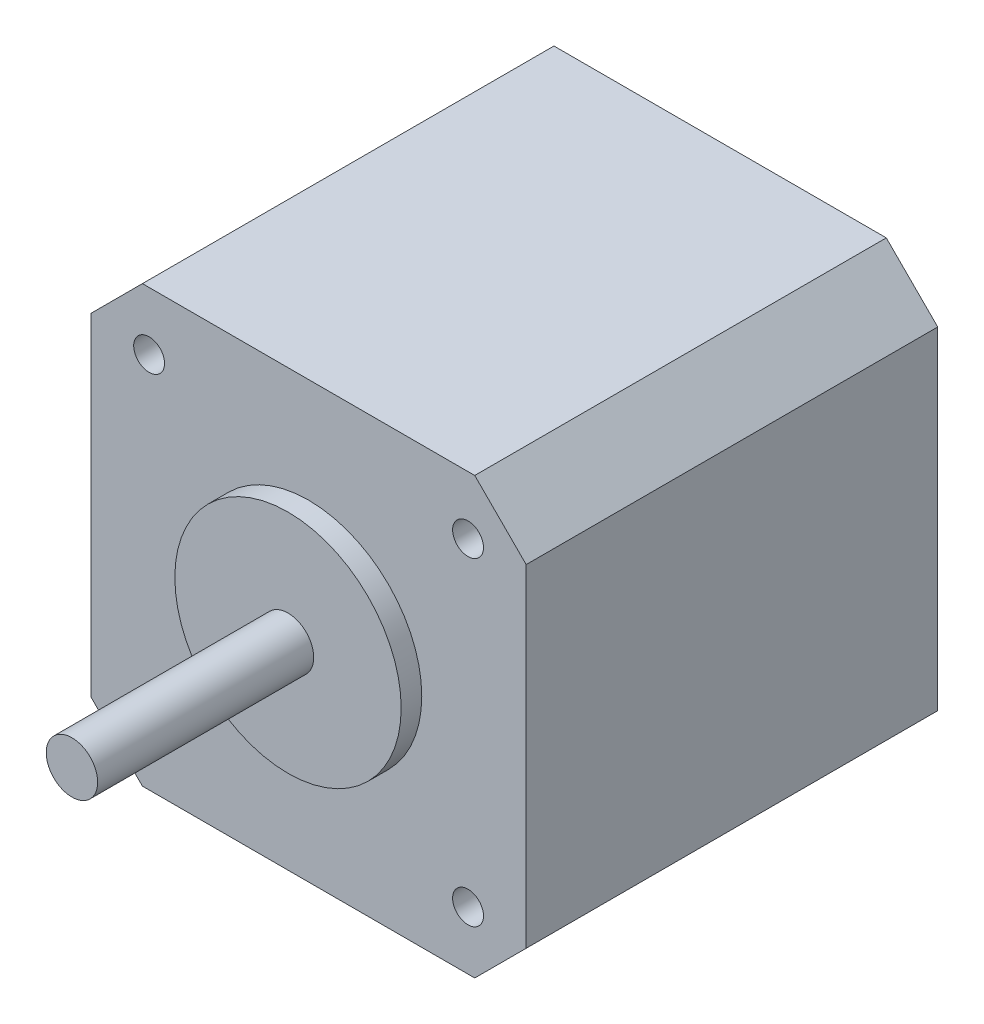
ISO-10303-21;
HEADER;
FILE_DESCRIPTION(('STEP AP214'),'2;1');
FILE_NAME('part.step','',(''),(''),'','','');
FILE_SCHEMA(('AUTOMOTIVE_DESIGN { 1 0 10303 214 1 1 1 1 }'));
ENDSEC;
DATA;
#1=APPLICATION_CONTEXT('core data for automotive mechanical design processes');
#2=APPLICATION_PROTOCOL_DEFINITION('international standard','automotive_design',2000,#1);
#3=PRODUCT_CONTEXT('',#1,'mechanical');
#4=PRODUCT('Part','Part','',(#3));
#5=PRODUCT_RELATED_PRODUCT_CATEGORY('part','',(#4));
#6=PRODUCT_DEFINITION_FORMATION('','',#4);
#7=PRODUCT_DEFINITION_CONTEXT('part definition',#1,'design');
#8=PRODUCT_DEFINITION('design','',#6,#7);
#9=PRODUCT_DEFINITION_SHAPE('','',#8);
#10=(LENGTH_UNIT() NAMED_UNIT(*) SI_UNIT(.MILLI.,.METRE.));
#11=(NAMED_UNIT(*) PLANE_ANGLE_UNIT() SI_UNIT($,.RADIAN.));
#12=(NAMED_UNIT(*) SI_UNIT($,.STERADIAN.) SOLID_ANGLE_UNIT());
#13=UNCERTAINTY_MEASURE_WITH_UNIT(LENGTH_MEASURE(1.E-05),#10,'distance_accuracy_value','');
#14=(GEOMETRIC_REPRESENTATION_CONTEXT(3) GLOBAL_UNCERTAINTY_ASSIGNED_CONTEXT((#13)) GLOBAL_UNIT_ASSIGNED_CONTEXT((#10,
#11,#12)) REPRESENTATION_CONTEXT('',''));
#15=CARTESIAN_POINT('',(0.,0.,0.));
#16=DIRECTION('',(0.,0.,1.));
#17=DIRECTION('',(1.,0.,0.));
#18=AXIS2_PLACEMENT_3D('',#15,#16,#17);
#19=CARTESIAN_POINT('',(0.,0.,20.));
#20=DIRECTION('',(0.,0.,-1.));
#21=DIRECTION('',(-1.,0.,0.));
#22=AXIS2_PLACEMENT_3D('',#19,#20,#21);
#23=PLANE('',#22);
#24=CARTESIAN_POINT('',(0.,0.,20.));
#25=DIRECTION('',(0.,0.,1.));
#26=DIRECTION('',(1.,0.,0.));
#27=AXIS2_PLACEMENT_3D('',#24,#25,#26);
#28=CIRCLE('',#27,11.);
#29=CARTESIAN_POINT('',(11.,0.,20.));
#30=VERTEX_POINT('',#29);
#31=EDGE_CURVE('E143',#30,#30,#28,.T.);
#32=ORIENTED_EDGE('',*,*,#31,.F.);
#33=EDGE_LOOP('',(#32));
#34=FACE_BOUND('',#33,.T.);
#35=DIRECTION('',(0.,-1.,0.));
#36=VECTOR('',#35,1.);
#37=CARTESIAN_POINT('',(-21.15,21.15,20.));
#38=LINE('',#37,#36);
#39=CARTESIAN_POINT('',(-21.15,16.15,20.));
#40=VERTEX_POINT('',#39);
#41=CARTESIAN_POINT('',(-21.15,-16.15,20.));
#42=VERTEX_POINT('',#41);
#43=EDGE_CURVE('E137',#40,#42,#38,.T.);
#44=ORIENTED_EDGE('',*,*,#43,.T.);
#45=DIRECTION('',(-0.707106781186547,0.707106781186548,0.));
#46=VECTOR('',#45,1.);
#47=CARTESIAN_POINT('',(-16.15,-21.15,20.));
#48=LINE('',#47,#46);
#49=CARTESIAN_POINT('',(-16.15,-21.15,20.));
#50=VERTEX_POINT('',#49);
#51=EDGE_CURVE('E157',#42,#50,#48,.F.);
#52=ORIENTED_EDGE('',*,*,#51,.T.);
#53=DIRECTION('',(1.,0.,0.));
#54=VECTOR('',#53,1.);
#55=CARTESIAN_POINT('',(21.15,-21.15,20.));
#56=LINE('',#55,#54);
#57=CARTESIAN_POINT('',(16.15,-21.15,20.));
#58=VERTEX_POINT('',#57);
#59=EDGE_CURVE('E119',#50,#58,#56,.T.);
#60=ORIENTED_EDGE('',*,*,#59,.T.);
#61=DIRECTION('',(-0.70710678118655,-0.707106781186546,0.));
#62=VECTOR('',#61,1.);
#63=CARTESIAN_POINT('',(21.15,-16.15,20.));
#64=LINE('',#63,#62);
#65=CARTESIAN_POINT('',(21.15,-16.15,20.));
#66=VERTEX_POINT('',#65);
#67=EDGE_CURVE('E155',#58,#66,#64,.F.);
#68=ORIENTED_EDGE('',*,*,#67,.T.);
#69=DIRECTION('',(0.,1.,0.));
#70=VECTOR('',#69,1.);
#71=CARTESIAN_POINT('',(21.15,21.15,20.));
#72=LINE('',#71,#70);
#73=CARTESIAN_POINT('',(21.15,16.15,20.));
#74=VERTEX_POINT('',#73);
#75=EDGE_CURVE('E178',#66,#74,#72,.T.);
#76=ORIENTED_EDGE('',*,*,#75,.T.);
#77=DIRECTION('',(0.707106781186546,-0.70710678118655,0.));
#78=VECTOR('',#77,1.);
#79=CARTESIAN_POINT('',(16.15,21.15,20.));
#80=LINE('',#79,#78);
#81=CARTESIAN_POINT('',(16.15,21.15,20.));
#82=VERTEX_POINT('',#81);
#83=EDGE_CURVE('E54',#74,#82,#80,.F.);
#84=ORIENTED_EDGE('',*,*,#83,.T.);
#85=DIRECTION('',(-1.,0.,0.));
#86=VECTOR('',#85,1.);
#87=CARTESIAN_POINT('',(21.15,21.15,20.));
#88=LINE('',#87,#86);
#89=CARTESIAN_POINT('',(-16.15,21.15,20.));
#90=VERTEX_POINT('',#89);
#91=EDGE_CURVE('E167',#82,#90,#88,.T.);
#92=ORIENTED_EDGE('',*,*,#91,.T.);
#93=DIRECTION('',(0.70710678118655,0.707106781186546,0.));
#94=VECTOR('',#93,1.);
#95=CARTESIAN_POINT('',(-21.15,16.15,20.));
#96=LINE('',#95,#94);
#97=EDGE_CURVE('E153',#90,#40,#96,.F.);
#98=ORIENTED_EDGE('',*,*,#97,.T.);
#99=EDGE_LOOP('',(#44,#52,#60,#68,#76,#84,#92,#98));
#100=FACE_BOUND('',#99,.T.);
#101=CARTESIAN_POINT('',(-15.5,15.5,20.));
#102=DIRECTION('',(0.,0.,1.));
#103=DIRECTION('',(1.,0.,0.));
#104=AXIS2_PLACEMENT_3D('',#101,#102,#103);
#105=CIRCLE('',#104,1.5);
#106=CARTESIAN_POINT('',(-14.,15.5,20.));
#107=VERTEX_POINT('',#106);
#108=EDGE_CURVE('E132',#107,#107,#105,.T.);
#109=ORIENTED_EDGE('',*,*,#108,.F.);
#110=EDGE_LOOP('',(#109));
#111=FACE_BOUND('',#110,.T.);
#112=CARTESIAN_POINT('',(-15.5,-15.5,20.));
#113=DIRECTION('',(0.,0.,1.));
#114=DIRECTION('',(1.,0.,0.));
#115=AXIS2_PLACEMENT_3D('',#112,#113,#114);
#116=CIRCLE('',#115,1.5);
#117=CARTESIAN_POINT('',(-14.,-15.5,20.));
#118=VERTEX_POINT('',#117);
#119=EDGE_CURVE('E204',#118,#118,#116,.T.);
#120=ORIENTED_EDGE('',*,*,#119,.F.);
#121=EDGE_LOOP('',(#120));
#122=FACE_BOUND('',#121,.T.);
#123=CARTESIAN_POINT('',(15.5,-15.5,20.));
#124=DIRECTION('',(0.,0.,1.));
#125=DIRECTION('',(-1.,0.,0.));
#126=AXIS2_PLACEMENT_3D('',#123,#124,#125);
#127=CIRCLE('',#126,1.5);
#128=CARTESIAN_POINT('',(14.,-15.5,20.));
#129=VERTEX_POINT('',#128);
#130=EDGE_CURVE('E198',#129,#129,#127,.T.);
#131=ORIENTED_EDGE('',*,*,#130,.F.);
#132=EDGE_LOOP('',(#131));
#133=FACE_BOUND('',#132,.T.);
#134=CARTESIAN_POINT('',(15.5,15.5,20.));
#135=DIRECTION('',(0.,0.,1.));
#136=DIRECTION('',(-1.,0.,0.));
#137=AXIS2_PLACEMENT_3D('',#134,#135,#136);
#138=CIRCLE('',#137,1.5);
#139=CARTESIAN_POINT('',(14.,15.5,20.));
#140=VERTEX_POINT('',#139);
#141=EDGE_CURVE('E191',#140,#140,#138,.T.);
#142=ORIENTED_EDGE('',*,*,#141,.F.);
#143=EDGE_LOOP('',(#142));
#144=FACE_BOUND('',#143,.T.);
#145=ADVANCED_FACE('F34',(#34,#100,#111,#122,#133,#144),#23,.F.);
#146=CARTESIAN_POINT('',(0.,0.,-20.));
#147=DIRECTION('',(0.,0.,-1.));
#148=DIRECTION('',(-1.,0.,0.));
#149=AXIS2_PLACEMENT_3D('',#146,#147,#148);
#150=PLANE('',#149);
#151=CARTESIAN_POINT('',(15.5,-15.5,-20.));
#152=DIRECTION('',(0.,0.,1.));
#153=DIRECTION('',(-1.,0.,0.));
#154=AXIS2_PLACEMENT_3D('',#151,#152,#153);
#155=CIRCLE('',#154,1.5);
#156=CARTESIAN_POINT('',(14.,-15.5,-20.));
#157=VERTEX_POINT('',#156);
#158=EDGE_CURVE('E194',#157,#157,#155,.T.);
#159=ORIENTED_EDGE('',*,*,#158,.T.);
#160=EDGE_LOOP('',(#159));
#161=FACE_BOUND('',#160,.T.);
#162=CARTESIAN_POINT('',(-15.5,15.5,-20.));
#163=DIRECTION('',(0.,0.,1.));
#164=DIRECTION('',(1.,0.,0.));
#165=AXIS2_PLACEMENT_3D('',#162,#163,#164);
#166=CIRCLE('',#165,1.5);
#167=CARTESIAN_POINT('',(-14.,15.5,-20.));
#168=VERTEX_POINT('',#167);
#169=EDGE_CURVE('E181',#168,#168,#166,.T.);
#170=ORIENTED_EDGE('',*,*,#169,.T.);
#171=EDGE_LOOP('',(#170));
#172=FACE_BOUND('',#171,.T.);
#173=DIRECTION('',(1.,0.,0.));
#174=VECTOR('',#173,1.);
#175=CARTESIAN_POINT('',(21.15,-21.15,-20.));
#176=LINE('',#175,#174);
#177=CARTESIAN_POINT('',(-16.15,-21.15,-20.));
#178=VERTEX_POINT('',#177);
#179=CARTESIAN_POINT('',(16.15,-21.15,-20.));
#180=VERTEX_POINT('',#179);
#181=EDGE_CURVE('E116',#178,#180,#176,.T.);
#182=ORIENTED_EDGE('',*,*,#181,.F.);
#183=DIRECTION('',(0.707106781186547,-0.707106781186548,0.));
#184=VECTOR('',#183,1.);
#185=CARTESIAN_POINT('',(-18.65,-18.65,-20.));
#186=LINE('',#185,#184);
#187=CARTESIAN_POINT('',(-21.15,-16.15,-20.));
#188=VERTEX_POINT('',#187);
#189=EDGE_CURVE('E99',#178,#188,#186,.F.);
#190=ORIENTED_EDGE('',*,*,#189,.T.);
#191=DIRECTION('',(0.,-1.,0.));
#192=VECTOR('',#191,1.);
#193=CARTESIAN_POINT('',(-21.15,21.15,-20.));
#194=LINE('',#193,#192);
#195=CARTESIAN_POINT('',(-21.15,16.15,-20.));
#196=VERTEX_POINT('',#195);
#197=EDGE_CURVE('E127',#196,#188,#194,.T.);
#198=ORIENTED_EDGE('',*,*,#197,.F.);
#199=DIRECTION('',(-0.70710678118655,-0.707106781186546,0.));
#200=VECTOR('',#199,1.);
#201=CARTESIAN_POINT('',(-18.6499999999999,18.65,-20.));
#202=LINE('',#201,#200);
#203=CARTESIAN_POINT('',(-16.15,21.15,-20.));
#204=VERTEX_POINT('',#203);
#205=EDGE_CURVE('E146',#196,#204,#202,.F.);
#206=ORIENTED_EDGE('',*,*,#205,.T.);
#207=DIRECTION('',(-1.,0.,0.));
#208=VECTOR('',#207,1.);
#209=CARTESIAN_POINT('',(21.15,21.15,-20.));
#210=LINE('',#209,#208);
#211=CARTESIAN_POINT('',(16.15,21.15,-20.));
#212=VERTEX_POINT('',#211);
#213=EDGE_CURVE('E130',#212,#204,#210,.T.);
#214=ORIENTED_EDGE('',*,*,#213,.F.);
#215=DIRECTION('',(-0.707106781186546,0.70710678118655,0.));
#216=VECTOR('',#215,1.);
#217=CARTESIAN_POINT('',(18.65,18.6499999999999,-20.));
#218=LINE('',#217,#216);
#219=CARTESIAN_POINT('',(21.15,16.15,-20.));
#220=VERTEX_POINT('',#219);
#221=EDGE_CURVE('E120',#212,#220,#218,.F.);
#222=ORIENTED_EDGE('',*,*,#221,.T.);
#223=DIRECTION('',(0.,1.,0.));
#224=VECTOR('',#223,1.);
#225=CARTESIAN_POINT('',(21.15,21.15,-20.));
#226=LINE('',#225,#224);
#227=CARTESIAN_POINT('',(21.15,-16.15,-20.));
#228=VERTEX_POINT('',#227);
#229=EDGE_CURVE('E126',#228,#220,#226,.T.);
#230=ORIENTED_EDGE('',*,*,#229,.F.);
#231=DIRECTION('',(0.70710678118655,0.707106781186546,0.));
#232=VECTOR('',#231,1.);
#233=CARTESIAN_POINT('',(18.6499999999999,-18.65,-20.));
#234=LINE('',#233,#232);
#235=EDGE_CURVE('E110',#228,#180,#234,.F.);
#236=ORIENTED_EDGE('',*,*,#235,.T.);
#237=EDGE_LOOP('',(#182,#190,#198,#206,#214,#222,#230,#236));
#238=FACE_BOUND('',#237,.T.);
#239=CARTESIAN_POINT('',(-15.5,-15.5,-20.));
#240=DIRECTION('',(0.,0.,1.));
#241=DIRECTION('',(1.,0.,0.));
#242=AXIS2_PLACEMENT_3D('',#239,#240,#241);
#243=CIRCLE('',#242,1.5);
#244=CARTESIAN_POINT('',(-14.,-15.5,-20.));
#245=VERTEX_POINT('',#244);
#246=EDGE_CURVE('E201',#245,#245,#243,.T.);
#247=ORIENTED_EDGE('',*,*,#246,.T.);
#248=EDGE_LOOP('',(#247));
#249=FACE_BOUND('',#248,.T.);
#250=CARTESIAN_POINT('',(15.5,15.5,-20.));
#251=DIRECTION('',(0.,0.,1.));
#252=DIRECTION('',(-1.,0.,0.));
#253=AXIS2_PLACEMENT_3D('',#250,#251,#252);
#254=CIRCLE('',#253,1.5);
#255=CARTESIAN_POINT('',(14.,15.5,-20.));
#256=VERTEX_POINT('',#255);
#257=EDGE_CURVE('E195',#256,#256,#254,.T.);
#258=ORIENTED_EDGE('',*,*,#257,.T.);
#259=EDGE_LOOP('',(#258));
#260=FACE_BOUND('',#259,.T.);
#261=ADVANCED_FACE('F123',(#161,#172,#238,#249,#260),#150,.T.);
#262=CARTESIAN_POINT('',(-21.15,21.15,20.));
#263=DIRECTION('',(1.,0.,0.));
#264=DIRECTION('',(0.,0.,-1.));
#265=AXIS2_PLACEMENT_3D('',#262,#263,#264);
#266=PLANE('',#265);
#267=ORIENTED_EDGE('',*,*,#197,.T.);
#268=DIRECTION('',(0.,0.,1.));
#269=VECTOR('',#268,1.);
#270=CARTESIAN_POINT('',(-21.15,-16.15,20.));
#271=LINE('',#270,#269);
#272=EDGE_CURVE('E104',#188,#42,#271,.T.);
#273=ORIENTED_EDGE('',*,*,#272,.T.);
#274=ORIENTED_EDGE('',*,*,#43,.F.);
#275=DIRECTION('',(0.,0.,-1.));
#276=VECTOR('',#275,1.);
#277=CARTESIAN_POINT('',(-21.15,16.15,20.));
#278=LINE('',#277,#276);
#279=EDGE_CURVE('E109',#40,#196,#278,.T.);
#280=ORIENTED_EDGE('',*,*,#279,.T.);
#281=EDGE_LOOP('',(#267,#273,#274,#280));
#282=FACE_BOUND('',#281,.T.);
#283=ADVANCED_FACE('F175',(#282),#266,.F.);
#284=CARTESIAN_POINT('',(21.15,-21.15,20.));
#285=DIRECTION('',(0.,1.,0.));
#286=DIRECTION('',(-1.,0.,0.));
#287=AXIS2_PLACEMENT_3D('',#284,#285,#286);
#288=PLANE('',#287);
#289=ORIENTED_EDGE('',*,*,#59,.F.);
#290=DIRECTION('',(0.,0.,-1.));
#291=VECTOR('',#290,1.);
#292=CARTESIAN_POINT('',(-16.15,-21.15,20.));
#293=LINE('',#292,#291);
#294=EDGE_CURVE('E103',#50,#178,#293,.T.);
#295=ORIENTED_EDGE('',*,*,#294,.T.);
#296=ORIENTED_EDGE('',*,*,#181,.T.);
#297=DIRECTION('',(0.,0.,1.));
#298=VECTOR('',#297,1.);
#299=CARTESIAN_POINT('',(16.15,-21.15,20.));
#300=LINE('',#299,#298);
#301=EDGE_CURVE('E121',#180,#58,#300,.T.);
#302=ORIENTED_EDGE('',*,*,#301,.T.);
#303=EDGE_LOOP('',(#289,#295,#296,#302));
#304=FACE_BOUND('',#303,.T.);
#305=ADVANCED_FACE('F115',(#304),#288,.F.);
#306=CARTESIAN_POINT('',(21.15,21.15,20.));
#307=DIRECTION('',(-1.,0.,0.));
#308=DIRECTION('',(0.,-1.,0.));
#309=AXIS2_PLACEMENT_3D('',#306,#307,#308);
#310=PLANE('',#309);
#311=ORIENTED_EDGE('',*,*,#75,.F.);
#312=DIRECTION('',(0.,0.,-1.));
#313=VECTOR('',#312,1.);
#314=CARTESIAN_POINT('',(21.15,-16.15,20.));
#315=LINE('',#314,#313);
#316=EDGE_CURVE('E161',#66,#228,#315,.T.);
#317=ORIENTED_EDGE('',*,*,#316,.T.);
#318=ORIENTED_EDGE('',*,*,#229,.T.);
#319=DIRECTION('',(0.,0.,1.));
#320=VECTOR('',#319,1.);
#321=CARTESIAN_POINT('',(21.15,16.15,20.));
#322=LINE('',#321,#320);
#323=EDGE_CURVE('E159',#220,#74,#322,.T.);
#324=ORIENTED_EDGE('',*,*,#323,.T.);
#325=EDGE_LOOP('',(#311,#317,#318,#324));
#326=FACE_BOUND('',#325,.T.);
#327=ADVANCED_FACE('F226',(#326),#310,.F.);
#328=CARTESIAN_POINT('',(21.15,21.15,20.));
#329=DIRECTION('',(0.,-1.,0.));
#330=DIRECTION('',(1.,0.,0.));
#331=AXIS2_PLACEMENT_3D('',#328,#329,#330);
#332=PLANE('',#331);
#333=ORIENTED_EDGE('',*,*,#213,.T.);
#334=DIRECTION('',(0.,0.,1.));
#335=VECTOR('',#334,1.);
#336=CARTESIAN_POINT('',(-16.15,21.15,20.));
#337=LINE('',#336,#335);
#338=EDGE_CURVE('E11',#204,#90,#337,.T.);
#339=ORIENTED_EDGE('',*,*,#338,.T.);
#340=ORIENTED_EDGE('',*,*,#91,.F.);
#341=DIRECTION('',(0.,0.,-1.));
#342=VECTOR('',#341,1.);
#343=CARTESIAN_POINT('',(16.15,21.15,20.));
#344=LINE('',#343,#342);
#345=EDGE_CURVE('E42',#82,#212,#344,.T.);
#346=ORIENTED_EDGE('',*,*,#345,.T.);
#347=EDGE_LOOP('',(#333,#339,#340,#346));
#348=FACE_BOUND('',#347,.T.);
#349=ADVANCED_FACE('F166',(#348),#332,.F.);
#350=CARTESIAN_POINT('',(-15.5,15.5,20.));
#351=DIRECTION('',(0.,0.,-1.));
#352=DIRECTION('',(-1.,0.,0.));
#353=AXIS2_PLACEMENT_3D('',#350,#351,#352);
#354=CYLINDRICAL_SURFACE('',#353,1.5);
#355=ORIENTED_EDGE('',*,*,#108,.T.);
#356=EDGE_LOOP('',(#355));
#357=FACE_BOUND('',#356,.T.);
#358=ORIENTED_EDGE('',*,*,#169,.F.);
#359=EDGE_LOOP('',(#358));
#360=FACE_BOUND('',#359,.T.);
#361=ADVANCED_FACE('F215',(#357,#360),#354,.F.);
#362=CARTESIAN_POINT('',(-15.5,-15.5,20.));
#363=DIRECTION('',(0.,0.,-1.));
#364=DIRECTION('',(-1.,0.,0.));
#365=AXIS2_PLACEMENT_3D('',#362,#363,#364);
#366=CYLINDRICAL_SURFACE('',#365,1.5);
#367=ORIENTED_EDGE('',*,*,#119,.T.);
#368=EDGE_LOOP('',(#367));
#369=FACE_BOUND('',#368,.T.);
#370=ORIENTED_EDGE('',*,*,#246,.F.);
#371=EDGE_LOOP('',(#370));
#372=FACE_BOUND('',#371,.T.);
#373=ADVANCED_FACE('F217',(#369,#372),#366,.F.);
#374=CARTESIAN_POINT('',(15.5,-15.5,20.));
#375=DIRECTION('',(0.,0.,-1.));
#376=DIRECTION('',(-1.,0.,0.));
#377=AXIS2_PLACEMENT_3D('',#374,#375,#376);
#378=CYLINDRICAL_SURFACE('',#377,1.5);
#379=ORIENTED_EDGE('',*,*,#130,.T.);
#380=EDGE_LOOP('',(#379));
#381=FACE_BOUND('',#380,.T.);
#382=ORIENTED_EDGE('',*,*,#158,.F.);
#383=EDGE_LOOP('',(#382));
#384=FACE_BOUND('',#383,.T.);
#385=ADVANCED_FACE('F223',(#381,#384),#378,.F.);
#386=CARTESIAN_POINT('',(15.5,15.5,20.));
#387=DIRECTION('',(0.,0.,-1.));
#388=DIRECTION('',(-1.,0.,0.));
#389=AXIS2_PLACEMENT_3D('',#386,#387,#388);
#390=CYLINDRICAL_SURFACE('',#389,1.5);
#391=ORIENTED_EDGE('',*,*,#141,.T.);
#392=EDGE_LOOP('',(#391));
#393=FACE_BOUND('',#392,.T.);
#394=ORIENTED_EDGE('',*,*,#257,.F.);
#395=EDGE_LOOP('',(#394));
#396=FACE_BOUND('',#395,.T.);
#397=ADVANCED_FACE('F268',(#393,#396),#390,.F.);
#398=CARTESIAN_POINT('',(0.,0.,22.));
#399=DIRECTION('',(0.,0.,-1.));
#400=DIRECTION('',(-1.,0.,0.));
#401=AXIS2_PLACEMENT_3D('',#398,#399,#400);
#402=CYLINDRICAL_SURFACE('',#401,11.);
#403=CARTESIAN_POINT('',(0.,0.,22.));
#404=DIRECTION('',(0.,0.,1.));
#405=DIRECTION('',(1.,0.,0.));
#406=AXIS2_PLACEMENT_3D('',#403,#404,#405);
#407=CIRCLE('',#406,11.);
#408=CARTESIAN_POINT('',(11.,0.,22.));
#409=VERTEX_POINT('',#408);
#410=EDGE_CURVE('E141',#409,#409,#407,.T.);
#411=ORIENTED_EDGE('',*,*,#410,.F.);
#412=EDGE_LOOP('',(#411));
#413=FACE_BOUND('',#412,.T.);
#414=ORIENTED_EDGE('',*,*,#31,.T.);
#415=EDGE_LOOP('',(#414));
#416=FACE_BOUND('',#415,.T.);
#417=ADVANCED_FACE('F271',(#413,#416),#402,.T.);
#418=CARTESIAN_POINT('',(0.,0.,22.));
#419=DIRECTION('',(0.,0.,1.));
#420=DIRECTION('',(1.,0.,0.));
#421=AXIS2_PLACEMENT_3D('',#418,#419,#420);
#422=PLANE('',#421);
#423=CARTESIAN_POINT('',(0.,0.,22.));
#424=DIRECTION('',(0.,0.,1.));
#425=DIRECTION('',(1.,0.,0.));
#426=AXIS2_PLACEMENT_3D('',#423,#424,#425);
#427=CIRCLE('',#426,2.5);
#428=CARTESIAN_POINT('',(2.5,0.,22.));
#429=VERTEX_POINT('',#428);
#430=EDGE_CURVE('E138',#429,#429,#427,.F.);
#431=ORIENTED_EDGE('',*,*,#430,.T.);
#432=EDGE_LOOP('',(#431));
#433=FACE_BOUND('',#432,.T.);
#434=ORIENTED_EDGE('',*,*,#410,.T.);
#435=EDGE_LOOP('',(#434));
#436=FACE_BOUND('',#435,.T.);
#437=ADVANCED_FACE('F279',(#433,#436),#422,.T.);
#438=CARTESIAN_POINT('',(0.,0.,43.));
#439=DIRECTION('',(0.,0.,-1.));
#440=DIRECTION('',(-1.,0.,0.));
#441=AXIS2_PLACEMENT_3D('',#438,#439,#440);
#442=CYLINDRICAL_SURFACE('',#441,2.5);
#443=ORIENTED_EDGE('',*,*,#430,.F.);
#444=EDGE_LOOP('',(#443));
#445=FACE_BOUND('',#444,.T.);
#446=CARTESIAN_POINT('',(0.,0.,43.));
#447=DIRECTION('',(0.,0.,1.));
#448=DIRECTION('',(1.,0.,0.));
#449=AXIS2_PLACEMENT_3D('',#446,#447,#448);
#450=CIRCLE('',#449,2.5);
#451=CARTESIAN_POINT('',(2.5,0.,43.));
#452=VERTEX_POINT('',#451);
#453=EDGE_CURVE('E142',#452,#452,#450,.T.);
#454=ORIENTED_EDGE('',*,*,#453,.F.);
#455=EDGE_LOOP('',(#454));
#456=FACE_BOUND('',#455,.T.);
#457=ADVANCED_FACE('F287',(#445,#456),#442,.T.);
#458=CARTESIAN_POINT('',(0.,0.,43.));
#459=DIRECTION('',(0.,0.,1.));
#460=DIRECTION('',(1.,0.,0.));
#461=AXIS2_PLACEMENT_3D('',#458,#459,#460);
#462=PLANE('',#461);
#463=ORIENTED_EDGE('',*,*,#453,.T.);
#464=EDGE_LOOP('',(#463));
#465=FACE_BOUND('',#464,.T.);
#466=ADVANCED_FACE('F247',(#465),#462,.T.);
#467=CARTESIAN_POINT('',(-16.15,-21.15,20.));
#468=DIRECTION('',(0.707106781186548,0.707106781186547,0.));
#469=DIRECTION('',(0.,0.,-1.));
#470=AXIS2_PLACEMENT_3D('',#467,#468,#469);
#471=PLANE('',#470);
#472=ORIENTED_EDGE('',*,*,#51,.F.);
#473=ORIENTED_EDGE('',*,*,#272,.F.);
#474=ORIENTED_EDGE('',*,*,#189,.F.);
#475=ORIENTED_EDGE('',*,*,#294,.F.);
#476=EDGE_LOOP('',(#472,#473,#474,#475));
#477=FACE_BOUND('',#476,.T.);
#478=ADVANCED_FACE('F102',(#477),#471,.F.);
#479=CARTESIAN_POINT('',(21.15,-16.15,20.));
#480=DIRECTION('',(-0.707106781186546,0.70710678118655,0.));
#481=DIRECTION('',(0.,0.,-1.));
#482=AXIS2_PLACEMENT_3D('',#479,#480,#481);
#483=PLANE('',#482);
#484=ORIENTED_EDGE('',*,*,#67,.F.);
#485=ORIENTED_EDGE('',*,*,#301,.F.);
#486=ORIENTED_EDGE('',*,*,#235,.F.);
#487=ORIENTED_EDGE('',*,*,#316,.F.);
#488=EDGE_LOOP('',(#484,#485,#486,#487));
#489=FACE_BOUND('',#488,.T.);
#490=ADVANCED_FACE('F246',(#489),#483,.F.);
#491=CARTESIAN_POINT('',(-21.15,16.15,20.));
#492=DIRECTION('',(0.707106781186546,-0.70710678118655,0.));
#493=DIRECTION('',(0.,0.,-1.));
#494=AXIS2_PLACEMENT_3D('',#491,#492,#493);
#495=PLANE('',#494);
#496=ORIENTED_EDGE('',*,*,#97,.F.);
#497=ORIENTED_EDGE('',*,*,#338,.F.);
#498=ORIENTED_EDGE('',*,*,#205,.F.);
#499=ORIENTED_EDGE('',*,*,#279,.F.);
#500=EDGE_LOOP('',(#496,#497,#498,#499));
#501=FACE_BOUND('',#500,.T.);
#502=ADVANCED_FACE('F172',(#501),#495,.F.);
#503=CARTESIAN_POINT('',(16.15,21.15,20.));
#504=DIRECTION('',(-0.70710678118655,-0.707106781186546,0.));
#505=DIRECTION('',(0.,0.,-1.));
#506=AXIS2_PLACEMENT_3D('',#503,#504,#505);
#507=PLANE('',#506);
#508=ORIENTED_EDGE('',*,*,#83,.F.);
#509=ORIENTED_EDGE('',*,*,#323,.F.);
#510=ORIENTED_EDGE('',*,*,#221,.F.);
#511=ORIENTED_EDGE('',*,*,#345,.F.);
#512=EDGE_LOOP('',(#508,#509,#510,#511));
#513=FACE_BOUND('',#512,.T.);
#514=ADVANCED_FACE('F36',(#513),#507,.F.);
#515=CLOSED_SHELL('',(#145,#261,#283,#305,#327,#349,#361,#373,#385,#397,#417,#437,#457,#466,
#478,#490,#502,#514));
#516=MANIFOLD_SOLID_BREP('B2',#515);
#517=ADVANCED_BREP_SHAPE_REPRESENTATION('',(#18,#516),#14);
#518=SHAPE_DEFINITION_REPRESENTATION(#9,#517);
ENDSEC;
END-ISO-10303-21;
